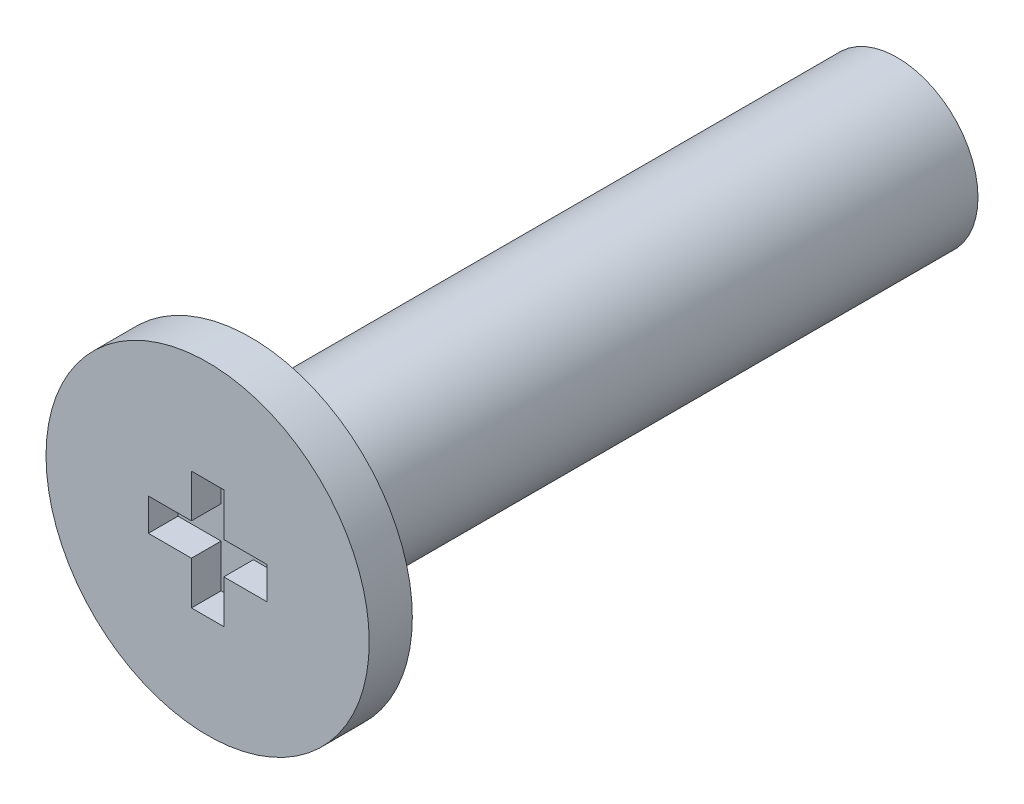
ISO-10303-21;
HEADER;
FILE_DESCRIPTION(('STEP AP214'),'2;1');
FILE_NAME('part.step','',(''),(''),'','','');
FILE_SCHEMA(('AUTOMOTIVE_DESIGN { 1 0 10303 214 1 1 1 1 }'));
ENDSEC;
DATA;
#1=APPLICATION_CONTEXT('core data for automotive mechanical design processes');
#2=APPLICATION_PROTOCOL_DEFINITION('international standard','automotive_design',2000,#1);
#3=PRODUCT_CONTEXT('',#1,'mechanical');
#4=PRODUCT('Part','Part','',(#3));
#5=PRODUCT_RELATED_PRODUCT_CATEGORY('part','',(#4));
#6=PRODUCT_DEFINITION_FORMATION('','',#4);
#7=PRODUCT_DEFINITION_CONTEXT('part definition',#1,'design');
#8=PRODUCT_DEFINITION('design','',#6,#7);
#9=PRODUCT_DEFINITION_SHAPE('','',#8);
#10=(LENGTH_UNIT() NAMED_UNIT(*) SI_UNIT(.MILLI.,.METRE.));
#11=(NAMED_UNIT(*) PLANE_ANGLE_UNIT() SI_UNIT($,.RADIAN.));
#12=(NAMED_UNIT(*) SI_UNIT($,.STERADIAN.) SOLID_ANGLE_UNIT());
#13=UNCERTAINTY_MEASURE_WITH_UNIT(LENGTH_MEASURE(1.E-05),#10,'distance_accuracy_value','');
#14=(GEOMETRIC_REPRESENTATION_CONTEXT(3) GLOBAL_UNCERTAINTY_ASSIGNED_CONTEXT((#13)) GLOBAL_UNIT_ASSIGNED_CONTEXT((#10,
#11,#12)) REPRESENTATION_CONTEXT('',''));
#15=CARTESIAN_POINT('',(0.,0.,0.));
#16=DIRECTION('',(0.,0.,1.));
#17=DIRECTION('',(1.,0.,0.));
#18=AXIS2_PLACEMENT_3D('',#15,#16,#17);
#19=CARTESIAN_POINT('',(0.,0.,-12.));
#20=DIRECTION('',(0.,0.,1.));
#21=DIRECTION('',(1.,0.,0.));
#22=AXIS2_PLACEMENT_3D('',#19,#20,#21);
#23=CYLINDRICAL_SURFACE('',#22,1.5);
#24=CARTESIAN_POINT('',(0.,0.,-12.));
#25=DIRECTION('',(0.,0.,1.));
#26=DIRECTION('',(1.,0.,0.));
#27=AXIS2_PLACEMENT_3D('',#24,#25,#26);
#28=CIRCLE('',#27,1.5);
#29=CARTESIAN_POINT('',(1.5,0.,-12.));
#30=VERTEX_POINT('',#29);
#31=EDGE_CURVE('E212',#30,#30,#28,.T.);
#32=ORIENTED_EDGE('',*,*,#31,.T.);
#33=EDGE_LOOP('',(#32));
#34=FACE_BOUND('',#33,.T.);
#35=CARTESIAN_POINT('',(0.,0.,0.));
#36=DIRECTION('',(0.,0.,1.));
#37=DIRECTION('',(1.,0.,0.));
#38=AXIS2_PLACEMENT_3D('',#35,#36,#37);
#39=CIRCLE('',#38,1.5);
#40=CARTESIAN_POINT('',(1.5,0.,0.));
#41=VERTEX_POINT('',#40);
#42=EDGE_CURVE('E208',#41,#41,#39,.T.);
#43=ORIENTED_EDGE('',*,*,#42,.F.);
#44=EDGE_LOOP('',(#43));
#45=FACE_BOUND('',#44,.T.);
#46=ADVANCED_FACE('F41',(#34,#45),#23,.T.);
#47=CARTESIAN_POINT('',(0.,0.,-12.));
#48=DIRECTION('',(0.,0.,1.));
#49=DIRECTION('',(1.,0.,0.));
#50=AXIS2_PLACEMENT_3D('',#47,#48,#49);
#51=PLANE('',#50);
#52=ORIENTED_EDGE('',*,*,#31,.F.);
#53=EDGE_LOOP('',(#52));
#54=FACE_BOUND('',#53,.T.);
#55=ADVANCED_FACE('F281',(#54),#51,.F.);
#56=CARTESIAN_POINT('',(0.,0.,0.));
#57=DIRECTION('',(0.,0.,1.));
#58=DIRECTION('',(1.,0.,0.));
#59=AXIS2_PLACEMENT_3D('',#56,#57,#58);
#60=PLANE('',#59);
#61=ORIENTED_EDGE('',*,*,#42,.T.);
#62=EDGE_LOOP('',(#61));
#63=FACE_BOUND('',#62,.T.);
#64=CARTESIAN_POINT('',(0.,0.,0.));
#65=DIRECTION('',(0.,0.,-1.));
#66=DIRECTION('',(-1.,0.,0.));
#67=AXIS2_PLACEMENT_3D('',#64,#65,#66);
#68=CIRCLE('',#67,3.);
#69=CARTESIAN_POINT('',(-3.,0.,0.));
#70=VERTEX_POINT('',#69);
#71=EDGE_CURVE('E210',#70,#70,#68,.T.);
#72=ORIENTED_EDGE('',*,*,#71,.T.);
#73=EDGE_LOOP('',(#72));
#74=FACE_BOUND('',#73,.T.);
#75=ADVANCED_FACE('F286',(#63,#74),#60,.F.);
#76=CARTESIAN_POINT('',(0.,0.,-2.));
#77=DIRECTION('',(0.,0.,-1.));
#78=DIRECTION('',(-1.,0.,0.));
#79=AXIS2_PLACEMENT_3D('',#76,#77,#78);
#80=CYLINDRICAL_SURFACE('',#79,3.);
#81=ORIENTED_EDGE('',*,*,#71,.F.);
#82=EDGE_LOOP('',(#81));
#83=FACE_BOUND('',#82,.T.);
#84=CARTESIAN_POINT('',(0.,0.,0.8));
#85=DIRECTION('',(0.,0.,-1.));
#86=DIRECTION('',(-1.,0.,0.));
#87=AXIS2_PLACEMENT_3D('',#84,#85,#86);
#88=CIRCLE('',#87,3.);
#89=CARTESIAN_POINT('',(-3.,0.,0.8));
#90=VERTEX_POINT('',#89);
#91=EDGE_CURVE('E180',#90,#90,#88,.T.);
#92=ORIENTED_EDGE('',*,*,#91,.T.);
#93=EDGE_LOOP('',(#92));
#94=FACE_BOUND('',#93,.T.);
#95=ADVANCED_FACE('F300',(#83,#94),#80,.T.);
#96=CARTESIAN_POINT('',(3.,0.,0.8));
#97=DIRECTION('',(0.,0.,-1.));
#98=DIRECTION('',(-1.,0.,0.));
#99=AXIS2_PLACEMENT_3D('',#96,#97,#98);
#100=PLANE('',#99);
#101=DIRECTION('',(-1.,0.,0.));
#102=VECTOR('',#101,1.);
#103=CARTESIAN_POINT('',(3.,-1.1,0.8));
#104=LINE('',#103,#102);
#105=CARTESIAN_POINT('',(0.3,-1.1,0.8));
#106=VERTEX_POINT('',#105);
#107=CARTESIAN_POINT('',(-0.3,-1.1,0.8));
#108=VERTEX_POINT('',#107);
#109=EDGE_CURVE('E211',#106,#108,#104,.T.);
#110=ORIENTED_EDGE('',*,*,#109,.T.);
#111=DIRECTION('',(0.,1.,0.));
#112=VECTOR('',#111,1.);
#113=CARTESIAN_POINT('',(-0.3,0.,0.8));
#114=LINE('',#113,#112);
#115=CARTESIAN_POINT('',(-0.3,-0.3,0.8));
#116=VERTEX_POINT('',#115);
#117=EDGE_CURVE('E11',#108,#116,#114,.T.);
#118=ORIENTED_EDGE('',*,*,#117,.T.);
#119=DIRECTION('',(-1.,0.,0.));
#120=VECTOR('',#119,1.);
#121=CARTESIAN_POINT('',(3.,-0.3,0.8));
#122=LINE('',#121,#120);
#123=CARTESIAN_POINT('',(-1.1,-0.3,0.8));
#124=VERTEX_POINT('',#123);
#125=EDGE_CURVE('E48',#116,#124,#122,.T.);
#126=ORIENTED_EDGE('',*,*,#125,.T.);
#127=DIRECTION('',(0.,1.,0.));
#128=VECTOR('',#127,1.);
#129=CARTESIAN_POINT('',(-1.1,0.,0.8));
#130=LINE('',#129,#128);
#131=CARTESIAN_POINT('',(-1.1,0.3,0.8));
#132=VERTEX_POINT('',#131);
#133=EDGE_CURVE('E245',#124,#132,#130,.T.);
#134=ORIENTED_EDGE('',*,*,#133,.T.);
#135=DIRECTION('',(1.,0.,0.));
#136=VECTOR('',#135,1.);
#137=CARTESIAN_POINT('',(3.,0.3,0.8));
#138=LINE('',#137,#136);
#139=CARTESIAN_POINT('',(-0.3,0.3,0.8));
#140=VERTEX_POINT('',#139);
#141=EDGE_CURVE('E236',#132,#140,#138,.T.);
#142=ORIENTED_EDGE('',*,*,#141,.T.);
#143=DIRECTION('',(0.,1.,0.));
#144=VECTOR('',#143,1.);
#145=CARTESIAN_POINT('',(-0.3,0.,0.8));
#146=LINE('',#145,#144);
#147=CARTESIAN_POINT('',(-0.3,1.1,0.8));
#148=VERTEX_POINT('',#147);
#149=EDGE_CURVE('E237',#140,#148,#146,.T.);
#150=ORIENTED_EDGE('',*,*,#149,.T.);
#151=DIRECTION('',(1.,0.,0.));
#152=VECTOR('',#151,1.);
#153=CARTESIAN_POINT('',(3.,1.1,0.8));
#154=LINE('',#153,#152);
#155=CARTESIAN_POINT('',(0.3,1.1,0.8));
#156=VERTEX_POINT('',#155);
#157=EDGE_CURVE('E231',#148,#156,#154,.T.);
#158=ORIENTED_EDGE('',*,*,#157,.T.);
#159=DIRECTION('',(0.,-1.,0.));
#160=VECTOR('',#159,1.);
#161=CARTESIAN_POINT('',(0.3,0.,0.8));
#162=LINE('',#161,#160);
#163=CARTESIAN_POINT('',(0.3,0.3,0.8));
#164=VERTEX_POINT('',#163);
#165=EDGE_CURVE('E229',#156,#164,#162,.T.);
#166=ORIENTED_EDGE('',*,*,#165,.T.);
#167=DIRECTION('',(1.,0.,0.));
#168=VECTOR('',#167,1.);
#169=CARTESIAN_POINT('',(3.,0.3,0.8));
#170=LINE('',#169,#168);
#171=CARTESIAN_POINT('',(1.1,0.3,0.8));
#172=VERTEX_POINT('',#171);
#173=EDGE_CURVE('E230',#164,#172,#170,.T.);
#174=ORIENTED_EDGE('',*,*,#173,.T.);
#175=DIRECTION('',(0.,-1.,0.));
#176=VECTOR('',#175,1.);
#177=CARTESIAN_POINT('',(1.1,0.,0.8));
#178=LINE('',#177,#176);
#179=CARTESIAN_POINT('',(1.1,-0.3,0.8));
#180=VERTEX_POINT('',#179);
#181=EDGE_CURVE('E224',#172,#180,#178,.T.);
#182=ORIENTED_EDGE('',*,*,#181,.T.);
#183=DIRECTION('',(-1.,0.,0.));
#184=VECTOR('',#183,1.);
#185=CARTESIAN_POINT('',(3.,-0.3,0.8));
#186=LINE('',#185,#184);
#187=CARTESIAN_POINT('',(0.3,-0.3,0.8));
#188=VERTEX_POINT('',#187);
#189=EDGE_CURVE('E222',#180,#188,#186,.T.);
#190=ORIENTED_EDGE('',*,*,#189,.T.);
#191=DIRECTION('',(0.,-1.,0.));
#192=VECTOR('',#191,1.);
#193=CARTESIAN_POINT('',(0.3,0.,0.8));
#194=LINE('',#193,#192);
#195=EDGE_CURVE('E217',#188,#106,#194,.T.);
#196=ORIENTED_EDGE('',*,*,#195,.T.);
#197=EDGE_LOOP('',(#110,#118,#126,#134,#142,#150,#158,#166,#174,#182,#190,#196));
#198=FACE_BOUND('',#197,.T.);
#199=ORIENTED_EDGE('',*,*,#91,.F.);
#200=EDGE_LOOP('',(#199));
#201=FACE_BOUND('',#200,.T.);
#202=ADVANCED_FACE('F244',(#198,#201),#100,.F.);
#203=CARTESIAN_POINT('',(-0.3,-0.3,0.25));
#204=DIRECTION('',(-1.,0.,0.));
#205=DIRECTION('',(0.,0.,1.));
#206=AXIS2_PLACEMENT_3D('',#203,#204,#205);
#207=PLANE('',#206);
#208=DIRECTION('',(0.,0.,1.));
#209=VECTOR('',#208,1.);
#210=CARTESIAN_POINT('',(-0.3,-1.1,0.25));
#211=LINE('',#210,#209);
#212=CARTESIAN_POINT('',(-0.3,-1.1,0.25));
#213=VERTEX_POINT('',#212);
#214=EDGE_CURVE('E54',#213,#108,#211,.T.);
#215=ORIENTED_EDGE('',*,*,#214,.F.);
#216=DIRECTION('',(0.,-1.,0.));
#217=VECTOR('',#216,1.);
#218=CARTESIAN_POINT('',(-0.3,-0.3,0.25));
#219=LINE('',#218,#217);
#220=CARTESIAN_POINT('',(-0.3,-0.3,0.25));
#221=VERTEX_POINT('',#220);
#222=EDGE_CURVE('E129',#221,#213,#219,.T.);
#223=ORIENTED_EDGE('',*,*,#222,.F.);
#224=DIRECTION('',(0.,0.,1.));
#225=VECTOR('',#224,1.);
#226=CARTESIAN_POINT('',(-0.3,-0.3,0.25));
#227=LINE('',#226,#225);
#228=EDGE_CURVE('E171',#221,#116,#227,.T.);
#229=ORIENTED_EDGE('',*,*,#228,.T.);
#230=ORIENTED_EDGE('',*,*,#117,.F.);
#231=EDGE_LOOP('',(#215,#223,#229,#230));
#232=FACE_BOUND('',#231,.T.);
#233=ADVANCED_FACE('F127',(#232),#207,.F.);
#234=CARTESIAN_POINT('',(-1.1,-0.3,0.25));
#235=DIRECTION('',(0.,-1.,0.));
#236=DIRECTION('',(0.,0.,-1.));
#237=AXIS2_PLACEMENT_3D('',#234,#235,#236);
#238=PLANE('',#237);
#239=ORIENTED_EDGE('',*,*,#228,.F.);
#240=DIRECTION('',(1.,0.,0.));
#241=VECTOR('',#240,1.);
#242=CARTESIAN_POINT('',(-1.1,-0.3,0.25));
#243=LINE('',#242,#241);
#244=CARTESIAN_POINT('',(-1.1,-0.3,0.25));
#245=VERTEX_POINT('',#244);
#246=EDGE_CURVE('E131',#245,#221,#243,.T.);
#247=ORIENTED_EDGE('',*,*,#246,.F.);
#248=DIRECTION('',(0.,0.,1.));
#249=VECTOR('',#248,1.);
#250=CARTESIAN_POINT('',(-1.1,-0.3,0.25));
#251=LINE('',#250,#249);
#252=EDGE_CURVE('E177',#245,#124,#251,.T.);
#253=ORIENTED_EDGE('',*,*,#252,.T.);
#254=ORIENTED_EDGE('',*,*,#125,.F.);
#255=EDGE_LOOP('',(#239,#247,#253,#254));
#256=FACE_BOUND('',#255,.T.);
#257=ADVANCED_FACE('F273',(#256),#238,.F.);
#258=CARTESIAN_POINT('',(-1.1,0.3,0.25));
#259=DIRECTION('',(-1.,0.,0.));
#260=DIRECTION('',(0.,0.,1.));
#261=AXIS2_PLACEMENT_3D('',#258,#259,#260);
#262=PLANE('',#261);
#263=ORIENTED_EDGE('',*,*,#252,.F.);
#264=DIRECTION('',(0.,-1.,0.));
#265=VECTOR('',#264,1.);
#266=CARTESIAN_POINT('',(-1.1,0.3,0.25));
#267=LINE('',#266,#265);
#268=CARTESIAN_POINT('',(-1.1,0.3,0.25));
#269=VERTEX_POINT('',#268);
#270=EDGE_CURVE('E175',#269,#245,#267,.T.);
#271=ORIENTED_EDGE('',*,*,#270,.F.);
#272=DIRECTION('',(0.,0.,1.));
#273=VECTOR('',#272,1.);
#274=CARTESIAN_POINT('',(-1.1,0.3,0.25));
#275=LINE('',#274,#273);
#276=EDGE_CURVE('E179',#269,#132,#275,.T.);
#277=ORIENTED_EDGE('',*,*,#276,.T.);
#278=ORIENTED_EDGE('',*,*,#133,.F.);
#279=EDGE_LOOP('',(#263,#271,#277,#278));
#280=FACE_BOUND('',#279,.T.);
#281=ADVANCED_FACE('F275',(#280),#262,.F.);
#282=CARTESIAN_POINT('',(-0.3,0.3,0.25));
#283=DIRECTION('',(0.,1.,0.));
#284=DIRECTION('',(0.,0.,1.));
#285=AXIS2_PLACEMENT_3D('',#282,#283,#284);
#286=PLANE('',#285);
#287=ORIENTED_EDGE('',*,*,#276,.F.);
#288=DIRECTION('',(-1.,0.,0.));
#289=VECTOR('',#288,1.);
#290=CARTESIAN_POINT('',(-0.3,0.3,0.25));
#291=LINE('',#290,#289);
#292=CARTESIAN_POINT('',(-0.3,0.3,0.25));
#293=VERTEX_POINT('',#292);
#294=EDGE_CURVE('E168',#293,#269,#291,.T.);
#295=ORIENTED_EDGE('',*,*,#294,.F.);
#296=DIRECTION('',(0.,0.,1.));
#297=VECTOR('',#296,1.);
#298=CARTESIAN_POINT('',(-0.3,0.3,0.25));
#299=LINE('',#298,#297);
#300=EDGE_CURVE('E181',#293,#140,#299,.T.);
#301=ORIENTED_EDGE('',*,*,#300,.T.);
#302=ORIENTED_EDGE('',*,*,#141,.F.);
#303=EDGE_LOOP('',(#287,#295,#301,#302));
#304=FACE_BOUND('',#303,.T.);
#305=ADVANCED_FACE('F269',(#304),#286,.F.);
#306=CARTESIAN_POINT('',(-0.3,1.1,0.25));
#307=DIRECTION('',(-1.,0.,0.));
#308=DIRECTION('',(0.,0.,1.));
#309=AXIS2_PLACEMENT_3D('',#306,#307,#308);
#310=PLANE('',#309);
#311=ORIENTED_EDGE('',*,*,#300,.F.);
#312=DIRECTION('',(0.,-1.,0.));
#313=VECTOR('',#312,1.);
#314=CARTESIAN_POINT('',(-0.3,1.1,0.25));
#315=LINE('',#314,#313);
#316=CARTESIAN_POINT('',(-0.3,1.1,0.25));
#317=VERTEX_POINT('',#316);
#318=EDGE_CURVE('E166',#317,#293,#315,.T.);
#319=ORIENTED_EDGE('',*,*,#318,.F.);
#320=DIRECTION('',(0.,0.,1.));
#321=VECTOR('',#320,1.);
#322=CARTESIAN_POINT('',(-0.3,1.1,0.25));
#323=LINE('',#322,#321);
#324=EDGE_CURVE('E188',#317,#148,#323,.T.);
#325=ORIENTED_EDGE('',*,*,#324,.T.);
#326=ORIENTED_EDGE('',*,*,#149,.F.);
#327=EDGE_LOOP('',(#311,#319,#325,#326));
#328=FACE_BOUND('',#327,.T.);
#329=ADVANCED_FACE('F266',(#328),#310,.F.);
#330=CARTESIAN_POINT('',(0.3,1.1,0.25));
#331=DIRECTION('',(0.,1.,0.));
#332=DIRECTION('',(0.,0.,1.));
#333=AXIS2_PLACEMENT_3D('',#330,#331,#332);
#334=PLANE('',#333);
#335=ORIENTED_EDGE('',*,*,#324,.F.);
#336=DIRECTION('',(-1.,0.,0.));
#337=VECTOR('',#336,1.);
#338=CARTESIAN_POINT('',(0.3,1.1,0.25));
#339=LINE('',#338,#337);
#340=CARTESIAN_POINT('',(0.3,1.1,0.25));
#341=VERTEX_POINT('',#340);
#342=EDGE_CURVE('E164',#341,#317,#339,.T.);
#343=ORIENTED_EDGE('',*,*,#342,.F.);
#344=DIRECTION('',(0.,0.,1.));
#345=VECTOR('',#344,1.);
#346=CARTESIAN_POINT('',(0.3,1.1,0.25));
#347=LINE('',#346,#345);
#348=EDGE_CURVE('E189',#341,#156,#347,.T.);
#349=ORIENTED_EDGE('',*,*,#348,.T.);
#350=ORIENTED_EDGE('',*,*,#157,.F.);
#351=EDGE_LOOP('',(#335,#343,#349,#350));
#352=FACE_BOUND('',#351,.T.);
#353=ADVANCED_FACE('F261',(#352),#334,.F.);
#354=CARTESIAN_POINT('',(0.3,0.3,0.25));
#355=DIRECTION('',(1.,0.,0.));
#356=DIRECTION('',(0.,0.,-1.));
#357=AXIS2_PLACEMENT_3D('',#354,#355,#356);
#358=PLANE('',#357);
#359=ORIENTED_EDGE('',*,*,#348,.F.);
#360=DIRECTION('',(0.,1.,0.));
#361=VECTOR('',#360,1.);
#362=CARTESIAN_POINT('',(0.3,0.3,0.25));
#363=LINE('',#362,#361);
#364=CARTESIAN_POINT('',(0.3,0.3,0.25));
#365=VERTEX_POINT('',#364);
#366=EDGE_CURVE('E158',#365,#341,#363,.T.);
#367=ORIENTED_EDGE('',*,*,#366,.F.);
#368=DIRECTION('',(0.,0.,1.));
#369=VECTOR('',#368,1.);
#370=CARTESIAN_POINT('',(0.3,0.3,0.25));
#371=LINE('',#370,#369);
#372=EDGE_CURVE('E195',#365,#164,#371,.T.);
#373=ORIENTED_EDGE('',*,*,#372,.T.);
#374=ORIENTED_EDGE('',*,*,#165,.F.);
#375=EDGE_LOOP('',(#359,#367,#373,#374));
#376=FACE_BOUND('',#375,.T.);
#377=ADVANCED_FACE('F263',(#376),#358,.F.);
#378=CARTESIAN_POINT('',(1.1,0.3,0.25));
#379=DIRECTION('',(0.,1.,0.));
#380=DIRECTION('',(0.,0.,1.));
#381=AXIS2_PLACEMENT_3D('',#378,#379,#380);
#382=PLANE('',#381);
#383=ORIENTED_EDGE('',*,*,#372,.F.);
#384=DIRECTION('',(-1.,0.,0.));
#385=VECTOR('',#384,1.);
#386=CARTESIAN_POINT('',(1.1,0.3,0.25));
#387=LINE('',#386,#385);
#388=CARTESIAN_POINT('',(1.1,0.3,0.25));
#389=VERTEX_POINT('',#388);
#390=EDGE_CURVE('E160',#389,#365,#387,.T.);
#391=ORIENTED_EDGE('',*,*,#390,.F.);
#392=DIRECTION('',(0.,0.,1.));
#393=VECTOR('',#392,1.);
#394=CARTESIAN_POINT('',(1.1,0.3,0.25));
#395=LINE('',#394,#393);
#396=EDGE_CURVE('E194',#389,#172,#395,.T.);
#397=ORIENTED_EDGE('',*,*,#396,.T.);
#398=ORIENTED_EDGE('',*,*,#173,.F.);
#399=EDGE_LOOP('',(#383,#391,#397,#398));
#400=FACE_BOUND('',#399,.T.);
#401=ADVANCED_FACE('F257',(#400),#382,.F.);
#402=CARTESIAN_POINT('',(1.1,-0.3,0.25));
#403=DIRECTION('',(1.,0.,0.));
#404=DIRECTION('',(0.,0.,-1.));
#405=AXIS2_PLACEMENT_3D('',#402,#403,#404);
#406=PLANE('',#405);
#407=ORIENTED_EDGE('',*,*,#396,.F.);
#408=DIRECTION('',(0.,1.,0.));
#409=VECTOR('',#408,1.);
#410=CARTESIAN_POINT('',(1.1,-0.3,0.25));
#411=LINE('',#410,#409);
#412=CARTESIAN_POINT('',(1.1,-0.3,0.25));
#413=VERTEX_POINT('',#412);
#414=EDGE_CURVE('E153',#413,#389,#411,.T.);
#415=ORIENTED_EDGE('',*,*,#414,.F.);
#416=DIRECTION('',(0.,0.,1.));
#417=VECTOR('',#416,1.);
#418=CARTESIAN_POINT('',(1.1,-0.3,0.25));
#419=LINE('',#418,#417);
#420=EDGE_CURVE('E198',#413,#180,#419,.T.);
#421=ORIENTED_EDGE('',*,*,#420,.T.);
#422=ORIENTED_EDGE('',*,*,#181,.F.);
#423=EDGE_LOOP('',(#407,#415,#421,#422));
#424=FACE_BOUND('',#423,.T.);
#425=ADVANCED_FACE('F253',(#424),#406,.F.);
#426=CARTESIAN_POINT('',(0.3,-0.3,0.25));
#427=DIRECTION('',(0.,-1.,0.));
#428=DIRECTION('',(0.,0.,-1.));
#429=AXIS2_PLACEMENT_3D('',#426,#427,#428);
#430=PLANE('',#429);
#431=ORIENTED_EDGE('',*,*,#420,.F.);
#432=DIRECTION('',(1.,0.,0.));
#433=VECTOR('',#432,1.);
#434=CARTESIAN_POINT('',(0.3,-0.3,0.25));
#435=LINE('',#434,#433);
#436=CARTESIAN_POINT('',(0.3,-0.3,0.25));
#437=VERTEX_POINT('',#436);
#438=EDGE_CURVE('E151',#437,#413,#435,.T.);
#439=ORIENTED_EDGE('',*,*,#438,.F.);
#440=DIRECTION('',(0.,0.,1.));
#441=VECTOR('',#440,1.);
#442=CARTESIAN_POINT('',(0.3,-0.3,0.25));
#443=LINE('',#442,#441);
#444=EDGE_CURVE('E201',#437,#188,#443,.T.);
#445=ORIENTED_EDGE('',*,*,#444,.T.);
#446=ORIENTED_EDGE('',*,*,#189,.F.);
#447=EDGE_LOOP('',(#431,#439,#445,#446));
#448=FACE_BOUND('',#447,.T.);
#449=ADVANCED_FACE('F255',(#448),#430,.F.);
#450=CARTESIAN_POINT('',(0.3,-1.1,0.25));
#451=DIRECTION('',(1.,0.,0.));
#452=DIRECTION('',(0.,0.,-1.));
#453=AXIS2_PLACEMENT_3D('',#450,#451,#452);
#454=PLANE('',#453);
#455=ORIENTED_EDGE('',*,*,#444,.F.);
#456=DIRECTION('',(0.,1.,0.));
#457=VECTOR('',#456,1.);
#458=CARTESIAN_POINT('',(0.3,-1.1,0.25));
#459=LINE('',#458,#457);
#460=CARTESIAN_POINT('',(0.3,-1.1,0.25));
#461=VERTEX_POINT('',#460);
#462=EDGE_CURVE('E142',#461,#437,#459,.T.);
#463=ORIENTED_EDGE('',*,*,#462,.F.);
#464=DIRECTION('',(0.,0.,1.));
#465=VECTOR('',#464,1.);
#466=CARTESIAN_POINT('',(0.3,-1.1,0.25));
#467=LINE('',#466,#465);
#468=EDGE_CURVE('E134',#461,#106,#467,.T.);
#469=ORIENTED_EDGE('',*,*,#468,.T.);
#470=ORIENTED_EDGE('',*,*,#195,.F.);
#471=EDGE_LOOP('',(#455,#463,#469,#470));
#472=FACE_BOUND('',#471,.T.);
#473=ADVANCED_FACE('F248',(#472),#454,.F.);
#474=CARTESIAN_POINT('',(-0.3,-1.1,0.25));
#475=DIRECTION('',(0.,-1.,0.));
#476=DIRECTION('',(0.,0.,-1.));
#477=AXIS2_PLACEMENT_3D('',#474,#475,#476);
#478=PLANE('',#477);
#479=ORIENTED_EDGE('',*,*,#468,.F.);
#480=DIRECTION('',(1.,0.,0.));
#481=VECTOR('',#480,1.);
#482=CARTESIAN_POINT('',(-0.3,-1.1,0.25));
#483=LINE('',#482,#481);
#484=EDGE_CURVE('E140',#213,#461,#483,.T.);
#485=ORIENTED_EDGE('',*,*,#484,.F.);
#486=ORIENTED_EDGE('',*,*,#214,.T.);
#487=ORIENTED_EDGE('',*,*,#109,.F.);
#488=EDGE_LOOP('',(#479,#485,#486,#487));
#489=FACE_BOUND('',#488,.T.);
#490=ADVANCED_FACE('F139',(#489),#478,.F.);
#491=CARTESIAN_POINT('',(0.,0.,0.25));
#492=DIRECTION('',(0.,0.,1.));
#493=DIRECTION('',(1.,0.,0.));
#494=AXIS2_PLACEMENT_3D('',#491,#492,#493);
#495=PLANE('',#494);
#496=ORIENTED_EDGE('',*,*,#222,.T.);
#497=ORIENTED_EDGE('',*,*,#484,.T.);
#498=ORIENTED_EDGE('',*,*,#462,.T.);
#499=ORIENTED_EDGE('',*,*,#438,.T.);
#500=ORIENTED_EDGE('',*,*,#414,.T.);
#501=ORIENTED_EDGE('',*,*,#390,.T.);
#502=ORIENTED_EDGE('',*,*,#366,.T.);
#503=ORIENTED_EDGE('',*,*,#342,.T.);
#504=ORIENTED_EDGE('',*,*,#318,.T.);
#505=ORIENTED_EDGE('',*,*,#294,.T.);
#506=ORIENTED_EDGE('',*,*,#270,.T.);
#507=ORIENTED_EDGE('',*,*,#246,.T.);
#508=EDGE_LOOP('',(#496,#497,#498,#499,#500,#501,#502,#503,#504,#505,#506,#507));
#509=FACE_BOUND('',#508,.T.);
#510=ADVANCED_FACE('F144',(#509),#495,.T.);
#511=CLOSED_SHELL('',(#46,#55,#75,#95,#202,#233,#257,#281,#305,#329,#353,#377,#401,#425,#449,
#473,#490,#510));
#512=MANIFOLD_SOLID_BREP('B2',#511);
#513=ADVANCED_BREP_SHAPE_REPRESENTATION('',(#18,#512),#14);
#514=SHAPE_DEFINITION_REPRESENTATION(#9,#513);
ENDSEC;
END-ISO-10303-21;
